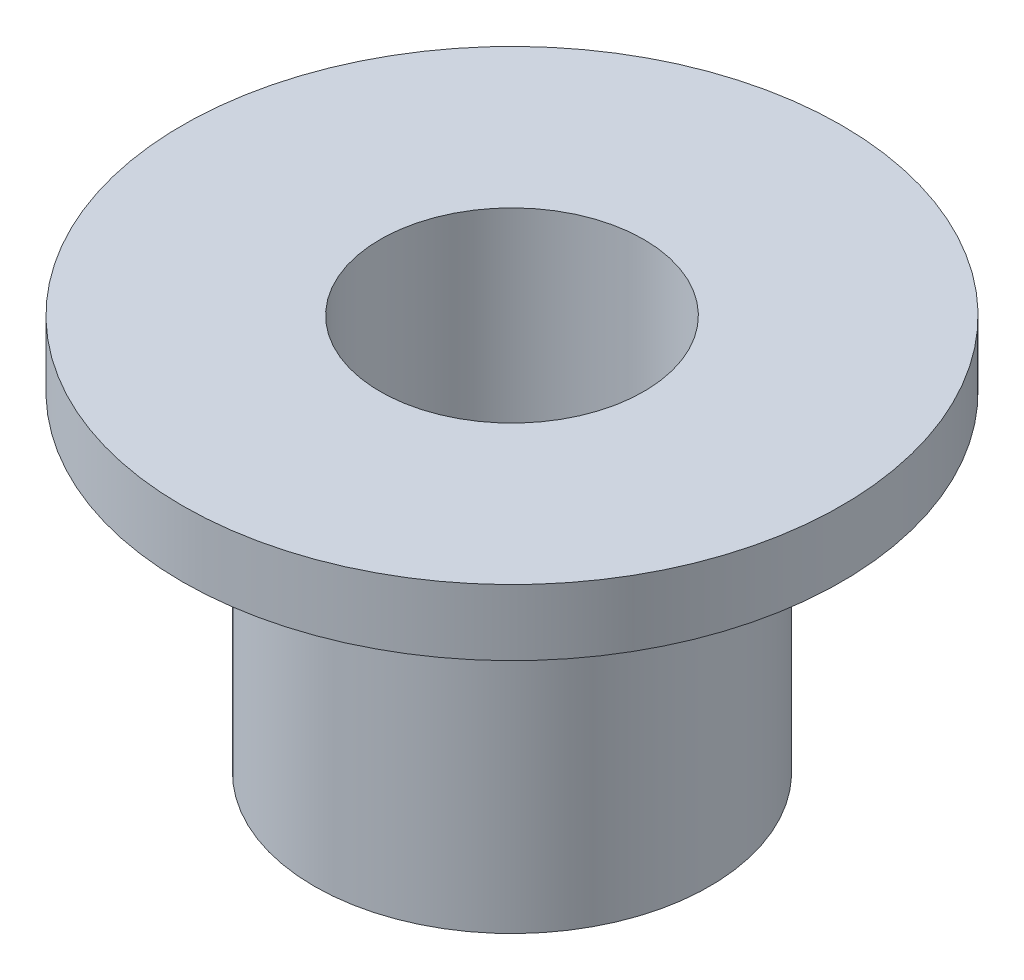
ISO-10303-21;
HEADER;
FILE_DESCRIPTION(('STEP AP214'),'2;1');
FILE_NAME('part.step','',(''),(''),'','','');
FILE_SCHEMA(('AUTOMOTIVE_DESIGN { 1 0 10303 214 1 1 1 1 }'));
ENDSEC;
DATA;
#1=APPLICATION_CONTEXT('core data for automotive mechanical design processes');
#2=APPLICATION_PROTOCOL_DEFINITION('international standard','automotive_design',2000,#1);
#3=PRODUCT_CONTEXT('',#1,'mechanical');
#4=PRODUCT('Part','Part','',(#3));
#5=PRODUCT_RELATED_PRODUCT_CATEGORY('part','',(#4));
#6=PRODUCT_DEFINITION_FORMATION('','',#4);
#7=PRODUCT_DEFINITION_CONTEXT('part definition',#1,'design');
#8=PRODUCT_DEFINITION('design','',#6,#7);
#9=PRODUCT_DEFINITION_SHAPE('','',#8);
#10=(LENGTH_UNIT() NAMED_UNIT(*) SI_UNIT(.MILLI.,.METRE.));
#11=(NAMED_UNIT(*) PLANE_ANGLE_UNIT() SI_UNIT($,.RADIAN.));
#12=(NAMED_UNIT(*) SI_UNIT($,.STERADIAN.) SOLID_ANGLE_UNIT());
#13=UNCERTAINTY_MEASURE_WITH_UNIT(LENGTH_MEASURE(1.E-05),#10,'distance_accuracy_value','');
#14=(GEOMETRIC_REPRESENTATION_CONTEXT(3) GLOBAL_UNCERTAINTY_ASSIGNED_CONTEXT((#13)) GLOBAL_UNIT_ASSIGNED_CONTEXT((#10,
#11,#12)) REPRESENTATION_CONTEXT('',''));
#15=CARTESIAN_POINT('',(0.,0.,0.));
#16=DIRECTION('',(0.,0.,1.));
#17=DIRECTION('',(1.,0.,0.));
#18=AXIS2_PLACEMENT_3D('',#15,#16,#17);
#19=CARTESIAN_POINT('',(-3.,0.,0.));
#20=DIRECTION('',(0.,1.,0.));
#21=DIRECTION('',(0.,0.,1.));
#22=AXIS2_PLACEMENT_3D('',#19,#20,#21);
#23=PLANE('',#22);
#24=CARTESIAN_POINT('',(0.,0.,0.));
#25=DIRECTION('',(0.,-1.,0.));
#26=DIRECTION('',(0.,0.,-1.));
#27=AXIS2_PLACEMENT_3D('',#24,#25,#26);
#28=CIRCLE('',#27,2.);
#29=CARTESIAN_POINT('',(0.,0.,-2.));
#30=VERTEX_POINT('',#29);
#31=EDGE_CURVE('E10',#30,#30,#28,.T.);
#32=ORIENTED_EDGE('',*,*,#31,.F.);
#33=EDGE_LOOP('',(#32));
#34=FACE_BOUND('',#33,.T.);
#35=CARTESIAN_POINT('',(0.,0.,0.));
#36=DIRECTION('',(0.,-1.,0.));
#37=DIRECTION('',(0.,0.,-1.));
#38=AXIS2_PLACEMENT_3D('',#35,#36,#37);
#39=CIRCLE('',#38,3.);
#40=CARTESIAN_POINT('',(0.,0.,-3.));
#41=VERTEX_POINT('',#40);
#42=EDGE_CURVE('E56',#41,#41,#39,.T.);
#43=ORIENTED_EDGE('',*,*,#42,.T.);
#44=EDGE_LOOP('',(#43));
#45=FACE_BOUND('',#44,.T.);
#46=ADVANCED_FACE('F40',(#34,#45),#23,.F.);
#47=CARTESIAN_POINT('',(0.,0.,0.));
#48=DIRECTION('',(0.,-1.,0.));
#49=DIRECTION('',(0.,0.,-1.));
#50=AXIS2_PLACEMENT_3D('',#47,#48,#49);
#51=CYLINDRICAL_SURFACE('',#50,2.);
#52=CARTESIAN_POINT('',(0.,6.,0.));
#53=DIRECTION('',(0.,-1.,0.));
#54=DIRECTION('',(0.,0.,-1.));
#55=AXIS2_PLACEMENT_3D('',#52,#53,#54);
#56=CIRCLE('',#55,2.);
#57=CARTESIAN_POINT('',(0.,6.,-2.));
#58=VERTEX_POINT('',#57);
#59=EDGE_CURVE('E43',#58,#58,#56,.T.);
#60=ORIENTED_EDGE('',*,*,#59,.F.);
#61=EDGE_LOOP('',(#60));
#62=FACE_BOUND('',#61,.T.);
#63=ORIENTED_EDGE('',*,*,#31,.T.);
#64=EDGE_LOOP('',(#63));
#65=FACE_BOUND('',#64,.T.);
#66=ADVANCED_FACE('F81',(#62,#65),#51,.F.);
#67=CARTESIAN_POINT('',(-2.,6.,0.));
#68=DIRECTION('',(0.,-1.,0.));
#69=DIRECTION('',(0.,0.,-1.));
#70=AXIS2_PLACEMENT_3D('',#67,#68,#69);
#71=PLANE('',#70);
#72=CARTESIAN_POINT('',(0.,6.,0.));
#73=DIRECTION('',(0.,-1.,0.));
#74=DIRECTION('',(0.,0.,-1.));
#75=AXIS2_PLACEMENT_3D('',#72,#73,#74);
#76=CIRCLE('',#75,5.);
#77=CARTESIAN_POINT('',(0.,6.,-5.));
#78=VERTEX_POINT('',#77);
#79=EDGE_CURVE('E50',#78,#78,#76,.T.);
#80=ORIENTED_EDGE('',*,*,#79,.F.);
#81=EDGE_LOOP('',(#80));
#82=FACE_BOUND('',#81,.T.);
#83=ORIENTED_EDGE('',*,*,#59,.T.);
#84=EDGE_LOOP('',(#83));
#85=FACE_BOUND('',#84,.T.);
#86=ADVANCED_FACE('F76',(#82,#85),#71,.F.);
#87=CARTESIAN_POINT('',(0.,0.,0.));
#88=DIRECTION('',(0.,-1.,0.));
#89=DIRECTION('',(0.,0.,-1.));
#90=AXIS2_PLACEMENT_3D('',#87,#88,#89);
#91=CYLINDRICAL_SURFACE('',#90,5.);
#92=CARTESIAN_POINT('',(0.,5.,0.));
#93=DIRECTION('',(0.,-1.,0.));
#94=DIRECTION('',(0.,0.,-1.));
#95=AXIS2_PLACEMENT_3D('',#92,#93,#94);
#96=CIRCLE('',#95,5.);
#97=CARTESIAN_POINT('',(0.,5.,-5.));
#98=VERTEX_POINT('',#97);
#99=EDGE_CURVE('E51',#98,#98,#96,.T.);
#100=ORIENTED_EDGE('',*,*,#99,.F.);
#101=EDGE_LOOP('',(#100));
#102=FACE_BOUND('',#101,.T.);
#103=ORIENTED_EDGE('',*,*,#79,.T.);
#104=EDGE_LOOP('',(#103));
#105=FACE_BOUND('',#104,.T.);
#106=ADVANCED_FACE('F71',(#102,#105),#91,.T.);
#107=CARTESIAN_POINT('',(-5.,5.,0.));
#108=DIRECTION('',(0.,1.,0.));
#109=DIRECTION('',(0.,0.,1.));
#110=AXIS2_PLACEMENT_3D('',#107,#108,#109);
#111=PLANE('',#110);
#112=CARTESIAN_POINT('',(0.,5.,0.));
#113=DIRECTION('',(0.,-1.,0.));
#114=DIRECTION('',(0.,0.,-1.));
#115=AXIS2_PLACEMENT_3D('',#112,#113,#114);
#116=CIRCLE('',#115,3.);
#117=CARTESIAN_POINT('',(0.,5.,-3.));
#118=VERTEX_POINT('',#117);
#119=EDGE_CURVE('E57',#118,#118,#116,.T.);
#120=ORIENTED_EDGE('',*,*,#119,.F.);
#121=EDGE_LOOP('',(#120));
#122=FACE_BOUND('',#121,.T.);
#123=ORIENTED_EDGE('',*,*,#99,.T.);
#124=EDGE_LOOP('',(#123));
#125=FACE_BOUND('',#124,.T.);
#126=ADVANCED_FACE('F70',(#122,#125),#111,.F.);
#127=CARTESIAN_POINT('',(0.,0.,0.));
#128=DIRECTION('',(0.,-1.,0.));
#129=DIRECTION('',(0.,0.,-1.));
#130=AXIS2_PLACEMENT_3D('',#127,#128,#129);
#131=CYLINDRICAL_SURFACE('',#130,3.);
#132=ORIENTED_EDGE('',*,*,#42,.F.);
#133=EDGE_LOOP('',(#132));
#134=FACE_BOUND('',#133,.T.);
#135=ORIENTED_EDGE('',*,*,#119,.T.);
#136=EDGE_LOOP('',(#135));
#137=FACE_BOUND('',#136,.T.);
#138=ADVANCED_FACE('F61',(#134,#137),#131,.T.);
#139=CLOSED_SHELL('',(#46,#66,#86,#106,#126,#138));
#140=MANIFOLD_SOLID_BREP('B2',#139);
#141=ADVANCED_BREP_SHAPE_REPRESENTATION('',(#18,#140),#14);
#142=SHAPE_DEFINITION_REPRESENTATION(#9,#141);
ENDSEC;
END-ISO-10303-21;
